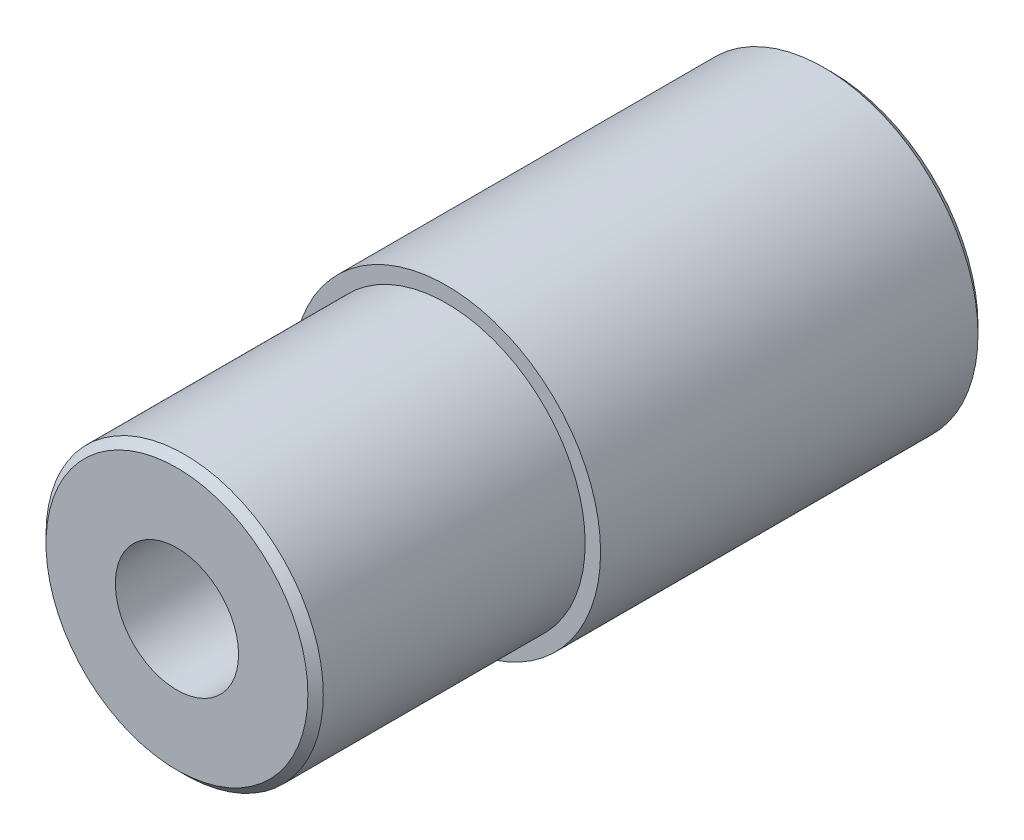
ISO-10303-21;
HEADER;
FILE_DESCRIPTION(('STEP AP214'),'2;1');
FILE_NAME('part.step','',(''),(''),'','','');
FILE_SCHEMA(('AUTOMOTIVE_DESIGN { 1 0 10303 214 1 1 1 1 }'));
ENDSEC;
DATA;
#1=APPLICATION_CONTEXT('core data for automotive mechanical design processes');
#2=APPLICATION_PROTOCOL_DEFINITION('international standard','automotive_design',2000,#1);
#3=PRODUCT_CONTEXT('',#1,'mechanical');
#4=PRODUCT('Part','Part','',(#3));
#5=PRODUCT_RELATED_PRODUCT_CATEGORY('part','',(#4));
#6=PRODUCT_DEFINITION_FORMATION('','',#4);
#7=PRODUCT_DEFINITION_CONTEXT('part definition',#1,'design');
#8=PRODUCT_DEFINITION('design','',#6,#7);
#9=PRODUCT_DEFINITION_SHAPE('','',#8);
#10=(LENGTH_UNIT() NAMED_UNIT(*) SI_UNIT(.MILLI.,.METRE.));
#11=(NAMED_UNIT(*) PLANE_ANGLE_UNIT() SI_UNIT($,.RADIAN.));
#12=(NAMED_UNIT(*) SI_UNIT($,.STERADIAN.) SOLID_ANGLE_UNIT());
#13=UNCERTAINTY_MEASURE_WITH_UNIT(LENGTH_MEASURE(1.E-05),#10,'distance_accuracy_value','');
#14=(GEOMETRIC_REPRESENTATION_CONTEXT(3) GLOBAL_UNCERTAINTY_ASSIGNED_CONTEXT((#13)) GLOBAL_UNIT_ASSIGNED_CONTEXT((#10,
#11,#12)) REPRESENTATION_CONTEXT('',''));
#15=CARTESIAN_POINT('',(0.,0.,0.));
#16=DIRECTION('',(0.,0.,1.));
#17=DIRECTION('',(1.,0.,0.));
#18=AXIS2_PLACEMENT_3D('',#15,#16,#17);
#19=CARTESIAN_POINT('',(0.,0.,50.));
#20=DIRECTION('',(0.,0.,1.));
#21=DIRECTION('',(1.,0.,0.));
#22=AXIS2_PLACEMENT_3D('',#19,#20,#21);
#23=PLANE('',#22);
#24=CARTESIAN_POINT('',(0.,0.,50.));
#25=DIRECTION('',(0.,0.,1.));
#26=DIRECTION('',(1.,0.,0.));
#27=AXIS2_PLACEMENT_3D('',#24,#25,#26);
#28=CIRCLE('',#27,20.);
#29=CARTESIAN_POINT('',(20.,0.,50.));
#30=VERTEX_POINT('',#29);
#31=EDGE_CURVE('E50',#30,#30,#28,.T.);
#32=ORIENTED_EDGE('',*,*,#31,.T.);
#33=EDGE_LOOP('',(#32));
#34=FACE_BOUND('',#33,.T.);
#35=CARTESIAN_POINT('',(0.,0.,50.));
#36=DIRECTION('',(0.,0.,1.));
#37=DIRECTION('',(1.,0.,0.));
#38=AXIS2_PLACEMENT_3D('',#35,#36,#37);
#39=CIRCLE('',#38,18.);
#40=CARTESIAN_POINT('',(18.,0.,50.));
#41=VERTEX_POINT('',#40);
#42=EDGE_CURVE('E53',#41,#41,#39,.T.);
#43=ORIENTED_EDGE('',*,*,#42,.F.);
#44=EDGE_LOOP('',(#43));
#45=FACE_BOUND('',#44,.T.);
#46=ADVANCED_FACE('F30',(#34,#45),#23,.T.);
#47=CARTESIAN_POINT('',(0.,0.,50.));
#48=DIRECTION('',(0.,0.,-1.));
#49=DIRECTION('',(-1.,0.,0.));
#50=AXIS2_PLACEMENT_3D('',#47,#48,#49);
#51=CYLINDRICAL_SURFACE('',#50,20.);
#52=CARTESIAN_POINT('',(0.,0.,1.));
#53=DIRECTION('',(0.,0.,1.));
#54=DIRECTION('',(1.,0.,0.));
#55=AXIS2_PLACEMENT_3D('',#52,#53,#54);
#56=CIRCLE('',#55,20.);
#57=CARTESIAN_POINT('',(20.,0.,1.));
#58=VERTEX_POINT('',#57);
#59=EDGE_CURVE('E45',#58,#58,#56,.T.);
#60=ORIENTED_EDGE('',*,*,#59,.T.);
#61=EDGE_LOOP('',(#60));
#62=FACE_BOUND('',#61,.T.);
#63=ORIENTED_EDGE('',*,*,#31,.F.);
#64=EDGE_LOOP('',(#63));
#65=FACE_BOUND('',#64,.T.);
#66=ADVANCED_FACE('F86',(#62,#65),#51,.T.);
#67=CARTESIAN_POINT('',(0.,0.,0.));
#68=DIRECTION('',(0.,0.,1.));
#69=DIRECTION('',(1.,0.,0.));
#70=AXIS2_PLACEMENT_3D('',#67,#68,#69);
#71=PLANE('',#70);
#72=CARTESIAN_POINT('',(0.,0.,0.));
#73=DIRECTION('',(0.,0.,1.));
#74=DIRECTION('',(1.,0.,0.));
#75=AXIS2_PLACEMENT_3D('',#72,#73,#74);
#76=CIRCLE('',#75,19.);
#77=CARTESIAN_POINT('',(19.,0.,0.));
#78=VERTEX_POINT('',#77);
#79=EDGE_CURVE('E41',#78,#78,#76,.F.);
#80=ORIENTED_EDGE('',*,*,#79,.T.);
#81=EDGE_LOOP('',(#80));
#82=FACE_BOUND('',#81,.T.);
#83=CARTESIAN_POINT('',(0.,0.,0.));
#84=DIRECTION('',(0.,0.,-1.));
#85=DIRECTION('',(-1.,0.,0.));
#86=AXIS2_PLACEMENT_3D('',#83,#84,#85);
#87=CIRCLE('',#86,12.5);
#88=CARTESIAN_POINT('',(-12.5,0.,0.));
#89=VERTEX_POINT('',#88);
#90=EDGE_CURVE('E57',#89,#89,#87,.T.);
#91=ORIENTED_EDGE('',*,*,#90,.F.);
#92=EDGE_LOOP('',(#91));
#93=FACE_BOUND('',#92,.T.);
#94=ADVANCED_FACE('F83',(#82,#93),#71,.F.);
#95=CARTESIAN_POINT('',(0.,0.,85.));
#96=DIRECTION('',(0.,0.,-1.));
#97=DIRECTION('',(-1.,0.,0.));
#98=AXIS2_PLACEMENT_3D('',#95,#96,#97);
#99=CYLINDRICAL_SURFACE('',#98,18.);
#100=CARTESIAN_POINT('',(0.,0.,84.));
#101=DIRECTION('',(0.,0.,1.));
#102=DIRECTION('',(1.,0.,0.));
#103=AXIS2_PLACEMENT_3D('',#100,#101,#102);
#104=CIRCLE('',#103,18.);
#105=CARTESIAN_POINT('',(18.,0.,84.));
#106=VERTEX_POINT('',#105);
#107=EDGE_CURVE('E10',#106,#106,#104,.F.);
#108=ORIENTED_EDGE('',*,*,#107,.T.);
#109=EDGE_LOOP('',(#108));
#110=FACE_BOUND('',#109,.T.);
#111=ORIENTED_EDGE('',*,*,#42,.T.);
#112=EDGE_LOOP('',(#111));
#113=FACE_BOUND('',#112,.T.);
#114=ADVANCED_FACE('F74',(#110,#113),#99,.T.);
#115=CARTESIAN_POINT('',(0.,0.,85.));
#116=DIRECTION('',(0.,0.,1.));
#117=DIRECTION('',(1.,0.,0.));
#118=AXIS2_PLACEMENT_3D('',#115,#116,#117);
#119=PLANE('',#118);
#120=CARTESIAN_POINT('',(0.,0.,85.));
#121=DIRECTION('',(0.,0.,1.));
#122=DIRECTION('',(1.,0.,0.));
#123=AXIS2_PLACEMENT_3D('',#120,#121,#122);
#124=CIRCLE('',#123,17.);
#125=CARTESIAN_POINT('',(17.,0.,85.));
#126=VERTEX_POINT('',#125);
#127=EDGE_CURVE('E37',#126,#126,#124,.T.);
#128=ORIENTED_EDGE('',*,*,#127,.T.);
#129=EDGE_LOOP('',(#128));
#130=FACE_BOUND('',#129,.T.);
#131=CARTESIAN_POINT('',(0.,0.,85.));
#132=DIRECTION('',(0.,0.,1.));
#133=DIRECTION('',(1.,0.,0.));
#134=AXIS2_PLACEMENT_3D('',#131,#132,#133);
#135=CIRCLE('',#134,8.);
#136=CARTESIAN_POINT('',(8.,0.,85.));
#137=VERTEX_POINT('',#136);
#138=EDGE_CURVE('E60',#137,#137,#135,.T.);
#139=ORIENTED_EDGE('',*,*,#138,.F.);
#140=EDGE_LOOP('',(#139));
#141=FACE_BOUND('',#140,.T.);
#142=ADVANCED_FACE('F71',(#130,#141),#119,.T.);
#143=CARTESIAN_POINT('',(0.,0.,28.));
#144=DIRECTION('',(0.,0.,-1.));
#145=DIRECTION('',(-1.,0.,0.));
#146=AXIS2_PLACEMENT_3D('',#143,#144,#145);
#147=CYLINDRICAL_SURFACE('',#146,12.5);
#148=CARTESIAN_POINT('',(0.,0.,28.));
#149=DIRECTION('',(0.,0.,-1.));
#150=DIRECTION('',(-1.,0.,0.));
#151=AXIS2_PLACEMENT_3D('',#148,#149,#150);
#152=CIRCLE('',#151,12.5);
#153=CARTESIAN_POINT('',(-12.5,0.,28.));
#154=VERTEX_POINT('',#153);
#155=EDGE_CURVE('E56',#154,#154,#152,.T.);
#156=ORIENTED_EDGE('',*,*,#155,.F.);
#157=EDGE_LOOP('',(#156));
#158=FACE_BOUND('',#157,.T.);
#159=ORIENTED_EDGE('',*,*,#90,.T.);
#160=EDGE_LOOP('',(#159));
#161=FACE_BOUND('',#160,.T.);
#162=ADVANCED_FACE('F73',(#158,#161),#147,.F.);
#163=CARTESIAN_POINT('',(0.,0.,28.));
#164=DIRECTION('',(0.,0.,-1.));
#165=DIRECTION('',(-1.,0.,0.));
#166=AXIS2_PLACEMENT_3D('',#163,#164,#165);
#167=PLANE('',#166);
#168=CARTESIAN_POINT('',(0.,0.,28.));
#169=DIRECTION('',(0.,0.,-1.));
#170=DIRECTION('',(-1.,0.,0.));
#171=AXIS2_PLACEMENT_3D('',#168,#169,#170);
#172=CIRCLE('',#171,8.);
#173=CARTESIAN_POINT('',(-8.,0.,28.));
#174=VERTEX_POINT('',#173);
#175=EDGE_CURVE('E63',#174,#174,#172,.F.);
#176=ORIENTED_EDGE('',*,*,#175,.T.);
#177=EDGE_LOOP('',(#176));
#178=FACE_BOUND('',#177,.T.);
#179=ORIENTED_EDGE('',*,*,#155,.T.);
#180=EDGE_LOOP('',(#179));
#181=FACE_BOUND('',#180,.T.);
#182=ADVANCED_FACE('F80',(#178,#181),#167,.T.);
#183=CARTESIAN_POINT('',(0.,0.,-0.001000000000001));
#184=DIRECTION('',(0.,0.,1.));
#185=DIRECTION('',(1.,0.,0.));
#186=AXIS2_PLACEMENT_3D('',#183,#184,#185);
#187=CYLINDRICAL_SURFACE('',#186,8.);
#188=ORIENTED_EDGE('',*,*,#175,.F.);
#189=EDGE_LOOP('',(#188));
#190=FACE_BOUND('',#189,.T.);
#191=ORIENTED_EDGE('',*,*,#138,.T.);
#192=EDGE_LOOP('',(#191));
#193=FACE_BOUND('',#192,.T.);
#194=ADVANCED_FACE('F69',(#190,#193),#187,.F.);
#195=CARTESIAN_POINT('',(0.,0.,1.));
#196=DIRECTION('',(0.,0.,1.));
#197=DIRECTION('',(1.,0.,0.));
#198=AXIS2_PLACEMENT_3D('',#195,#196,#197);
#199=CONICAL_SURFACE('',#198,20.,0.78539816339745);
#200=ORIENTED_EDGE('',*,*,#79,.F.);
#201=EDGE_LOOP('',(#200));
#202=FACE_BOUND('',#201,.T.);
#203=ORIENTED_EDGE('',*,*,#59,.F.);
#204=EDGE_LOOP('',(#203));
#205=FACE_BOUND('',#204,.T.);
#206=ADVANCED_FACE('F98',(#202,#205),#199,.T.);
#207=CARTESIAN_POINT('',(0.,0.,85.));
#208=DIRECTION('',(0.,0.,-1.));
#209=DIRECTION('',(-1.,0.,0.));
#210=AXIS2_PLACEMENT_3D('',#207,#208,#209);
#211=CONICAL_SURFACE('',#210,17.,0.785398163397447);
#212=ORIENTED_EDGE('',*,*,#107,.F.);
#213=EDGE_LOOP('',(#212));
#214=FACE_BOUND('',#213,.T.);
#215=ORIENTED_EDGE('',*,*,#127,.F.);
#216=EDGE_LOOP('',(#215));
#217=FACE_BOUND('',#216,.T.);
#218=ADVANCED_FACE('F32',(#214,#217),#211,.T.);
#219=CLOSED_SHELL('',(#46,#66,#94,#114,#142,#162,#182,#194,#206,#218));
#220=MANIFOLD_SOLID_BREP('B2',#219);
#221=ADVANCED_BREP_SHAPE_REPRESENTATION('',(#18,#220),#14);
#222=SHAPE_DEFINITION_REPRESENTATION(#9,#221);
ENDSEC;
END-ISO-10303-21;
